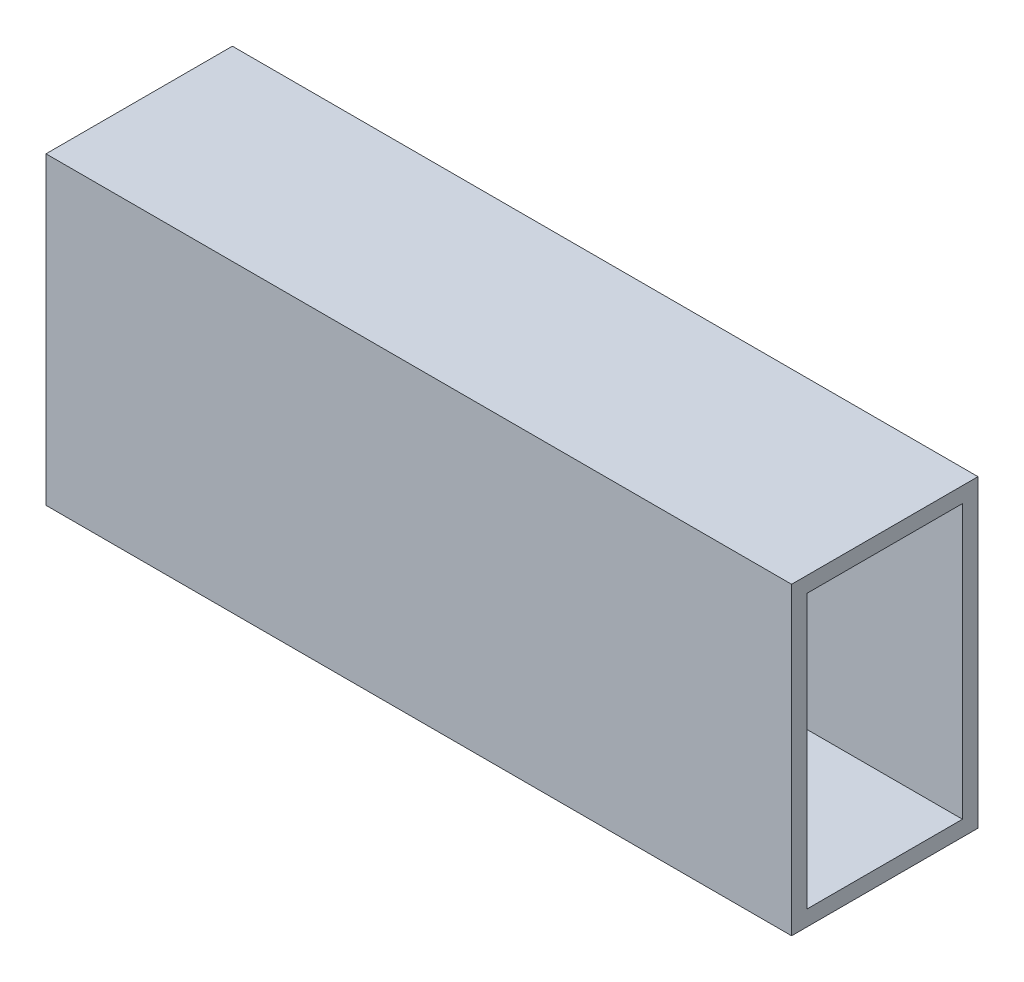
ISO-10303-21;
HEADER;
FILE_DESCRIPTION(('STEP AP214'),'2;1');
FILE_NAME('part.step','',(''),(''),'','','');
FILE_SCHEMA(('AUTOMOTIVE_DESIGN { 1 0 10303 214 1 1 1 1 }'));
ENDSEC;
DATA;
#1=APPLICATION_CONTEXT('core data for automotive mechanical design processes');
#2=APPLICATION_PROTOCOL_DEFINITION('international standard','automotive_design',2000,#1);
#3=PRODUCT_CONTEXT('',#1,'mechanical');
#4=PRODUCT('Part','Part','',(#3));
#5=PRODUCT_RELATED_PRODUCT_CATEGORY('part','',(#4));
#6=PRODUCT_DEFINITION_FORMATION('','',#4);
#7=PRODUCT_DEFINITION_CONTEXT('part definition',#1,'design');
#8=PRODUCT_DEFINITION('design','',#6,#7);
#9=PRODUCT_DEFINITION_SHAPE('','',#8);
#10=(LENGTH_UNIT() NAMED_UNIT(*) SI_UNIT(.MILLI.,.METRE.));
#11=(NAMED_UNIT(*) PLANE_ANGLE_UNIT() SI_UNIT($,.RADIAN.));
#12=(NAMED_UNIT(*) SI_UNIT($,.STERADIAN.) SOLID_ANGLE_UNIT());
#13=UNCERTAINTY_MEASURE_WITH_UNIT(LENGTH_MEASURE(1.E-05),#10,'distance_accuracy_value','');
#14=(GEOMETRIC_REPRESENTATION_CONTEXT(3) GLOBAL_UNCERTAINTY_ASSIGNED_CONTEXT((#13)) GLOBAL_UNIT_ASSIGNED_CONTEXT((#10,
#11,#12)) REPRESENTATION_CONTEXT('',''));
#15=CARTESIAN_POINT('',(0.,0.,0.));
#16=DIRECTION('',(0.,0.,1.));
#17=DIRECTION('',(1.,0.,0.));
#18=AXIS2_PLACEMENT_3D('',#15,#16,#17);
#19=CARTESIAN_POINT('',(0.,5.,0.));
#20=DIRECTION('',(0.,1.,0.));
#21=DIRECTION('',(0.,0.,1.));
#22=AXIS2_PLACEMENT_3D('',#19,#20,#21);
#23=PLANE('',#22);
#24=DIRECTION('',(0.,0.,1.));
#25=VECTOR('',#24,1.);
#26=CARTESIAN_POINT('',(-115.,5.,0.));
#27=LINE('',#26,#25);
#28=CARTESIAN_POINT('',(-115.,5.,-25.));
#29=VERTEX_POINT('',#28);
#30=CARTESIAN_POINT('',(-115.,5.,25.));
#31=VERTEX_POINT('',#30);
#32=EDGE_CURVE('E163',#29,#31,#27,.T.);
#33=ORIENTED_EDGE('',*,*,#32,.T.);
#34=DIRECTION('',(1.,0.,0.));
#35=VECTOR('',#34,1.);
#36=CARTESIAN_POINT('',(0.,5.,25.));
#37=LINE('',#36,#35);
#38=CARTESIAN_POINT('',(120.,5.,25.));
#39=VERTEX_POINT('',#38);
#40=EDGE_CURVE('E80',#31,#39,#37,.T.);
#41=ORIENTED_EDGE('',*,*,#40,.T.);
#42=DIRECTION('',(0.,0.,-1.));
#43=VECTOR('',#42,1.);
#44=CARTESIAN_POINT('',(120.,5.,-30.));
#45=LINE('',#44,#43);
#46=CARTESIAN_POINT('',(120.,5.,-25.));
#47=VERTEX_POINT('',#46);
#48=EDGE_CURVE('E181',#39,#47,#45,.T.);
#49=ORIENTED_EDGE('',*,*,#48,.T.);
#50=DIRECTION('',(1.,0.,0.));
#51=VECTOR('',#50,1.);
#52=CARTESIAN_POINT('',(-115.,5.,-25.));
#53=LINE('',#52,#51);
#54=EDGE_CURVE('E157',#29,#47,#53,.T.);
#55=ORIENTED_EDGE('',*,*,#54,.F.);
#56=EDGE_LOOP('',(#33,#41,#49,#55));
#57=FACE_BOUND('',#56,.T.);
#58=ADVANCED_FACE('F65',(#57),#23,.T.);
#59=CARTESIAN_POINT('',(120.,5.,-30.));
#60=DIRECTION('',(-1.,0.,0.));
#61=DIRECTION('',(0.,0.,1.));
#62=AXIS2_PLACEMENT_3D('',#59,#60,#61);
#63=PLANE('',#62);
#64=DIRECTION('',(0.,0.,-1.));
#65=VECTOR('',#64,1.);
#66=CARTESIAN_POINT('',(120.,93.,-30.));
#67=LINE('',#66,#65);
#68=CARTESIAN_POINT('',(120.,93.,25.));
#69=VERTEX_POINT('',#68);
#70=CARTESIAN_POINT('',(120.,93.,-25.));
#71=VERTEX_POINT('',#70);
#72=EDGE_CURVE('E151',#69,#71,#67,.T.);
#73=ORIENTED_EDGE('',*,*,#72,.T.);
#74=DIRECTION('',(0.,-1.,0.));
#75=VECTOR('',#74,1.);
#76=CARTESIAN_POINT('',(120.,93.,-25.));
#77=LINE('',#76,#75);
#78=EDGE_CURVE('E167',#71,#47,#77,.T.);
#79=ORIENTED_EDGE('',*,*,#78,.T.);
#80=ORIENTED_EDGE('',*,*,#48,.F.);
#81=DIRECTION('',(0.,-1.,0.));
#82=VECTOR('',#81,1.);
#83=CARTESIAN_POINT('',(120.,93.,25.));
#84=LINE('',#83,#82);
#85=EDGE_CURVE('E165',#69,#39,#84,.T.);
#86=ORIENTED_EDGE('',*,*,#85,.F.);
#87=EDGE_LOOP('',(#73,#79,#80,#86));
#88=FACE_BOUND('',#87,.T.);
#89=DIRECTION('',(0.,0.,-1.));
#90=VECTOR('',#89,1.);
#91=CARTESIAN_POINT('',(120.,0.,-30.));
#92=LINE('',#91,#90);
#93=CARTESIAN_POINT('',(120.,0.,30.));
#94=VERTEX_POINT('',#93);
#95=CARTESIAN_POINT('',(120.,0.,-30.));
#96=VERTEX_POINT('',#95);
#97=EDGE_CURVE('E136',#94,#96,#92,.T.);
#98=ORIENTED_EDGE('',*,*,#97,.T.);
#99=DIRECTION('',(0.,-1.,0.));
#100=VECTOR('',#99,1.);
#101=CARTESIAN_POINT('',(120.,5.,-30.));
#102=LINE('',#101,#100);
#103=CARTESIAN_POINT('',(120.,98.,-30.));
#104=VERTEX_POINT('',#103);
#105=EDGE_CURVE('E12',#104,#96,#102,.T.);
#106=ORIENTED_EDGE('',*,*,#105,.F.);
#107=DIRECTION('',(0.,0.,-1.));
#108=VECTOR('',#107,1.);
#109=CARTESIAN_POINT('',(120.,98.,-30.));
#110=LINE('',#109,#108);
#111=CARTESIAN_POINT('',(120.,98.,30.));
#112=VERTEX_POINT('',#111);
#113=EDGE_CURVE('E134',#112,#104,#110,.T.);
#114=ORIENTED_EDGE('',*,*,#113,.F.);
#115=DIRECTION('',(0.,-1.,0.));
#116=VECTOR('',#115,1.);
#117=CARTESIAN_POINT('',(120.,5.,30.));
#118=LINE('',#117,#116);
#119=EDGE_CURVE('E184',#112,#94,#118,.T.);
#120=ORIENTED_EDGE('',*,*,#119,.T.);
#121=EDGE_LOOP('',(#98,#106,#114,#120));
#122=FACE_BOUND('',#121,.T.);
#123=ADVANCED_FACE('F67',(#88,#122),#63,.F.);
#124=CARTESIAN_POINT('',(-120.,5.,-30.));
#125=DIRECTION('',(0.,0.,1.));
#126=DIRECTION('',(1.,0.,0.));
#127=AXIS2_PLACEMENT_3D('',#124,#125,#126);
#128=PLANE('',#127);
#129=DIRECTION('',(-1.,0.,0.));
#130=VECTOR('',#129,1.);
#131=CARTESIAN_POINT('',(-120.,0.,-30.));
#132=LINE('',#131,#130);
#133=CARTESIAN_POINT('',(-120.,0.,-30.));
#134=VERTEX_POINT('',#133);
#135=EDGE_CURVE('E186',#96,#134,#132,.T.);
#136=ORIENTED_EDGE('',*,*,#135,.T.);
#137=DIRECTION('',(0.,-1.,0.));
#138=VECTOR('',#137,1.);
#139=CARTESIAN_POINT('',(-120.,5.,-30.));
#140=LINE('',#139,#138);
#141=CARTESIAN_POINT('',(-120.,98.,-30.));
#142=VERTEX_POINT('',#141);
#143=EDGE_CURVE('E73',#142,#134,#140,.T.);
#144=ORIENTED_EDGE('',*,*,#143,.F.);
#145=DIRECTION('',(-1.,0.,0.));
#146=VECTOR('',#145,1.);
#147=CARTESIAN_POINT('',(-120.,98.,-30.));
#148=LINE('',#147,#146);
#149=EDGE_CURVE('E139',#104,#142,#148,.T.);
#150=ORIENTED_EDGE('',*,*,#149,.F.);
#151=ORIENTED_EDGE('',*,*,#105,.T.);
#152=EDGE_LOOP('',(#136,#144,#150,#151));
#153=FACE_BOUND('',#152,.T.);
#154=ADVANCED_FACE('F140',(#153),#128,.F.);
#155=CARTESIAN_POINT('',(-120.,5.,-30.));
#156=DIRECTION('',(1.,0.,0.));
#157=DIRECTION('',(0.,0.,-1.));
#158=AXIS2_PLACEMENT_3D('',#155,#156,#157);
#159=PLANE('',#158);
#160=DIRECTION('',(0.,0.,1.));
#161=VECTOR('',#160,1.);
#162=CARTESIAN_POINT('',(-120.,0.,-30.));
#163=LINE('',#162,#161);
#164=CARTESIAN_POINT('',(-120.,0.,30.));
#165=VERTEX_POINT('',#164);
#166=EDGE_CURVE('E188',#134,#165,#163,.T.);
#167=ORIENTED_EDGE('',*,*,#166,.T.);
#168=DIRECTION('',(0.,-1.,0.));
#169=VECTOR('',#168,1.);
#170=CARTESIAN_POINT('',(-120.,5.,30.));
#171=LINE('',#170,#169);
#172=CARTESIAN_POINT('',(-120.,98.,30.));
#173=VERTEX_POINT('',#172);
#174=EDGE_CURVE('E192',#173,#165,#171,.T.);
#175=ORIENTED_EDGE('',*,*,#174,.F.);
#176=DIRECTION('',(0.,0.,1.));
#177=VECTOR('',#176,1.);
#178=CARTESIAN_POINT('',(-120.,98.,-30.));
#179=LINE('',#178,#177);
#180=EDGE_CURVE('E145',#142,#173,#179,.T.);
#181=ORIENTED_EDGE('',*,*,#180,.F.);
#182=ORIENTED_EDGE('',*,*,#143,.T.);
#183=EDGE_LOOP('',(#167,#175,#181,#182));
#184=FACE_BOUND('',#183,.T.);
#185=ADVANCED_FACE('F195',(#184),#159,.F.);
#186=CARTESIAN_POINT('',(-120.,5.,30.));
#187=DIRECTION('',(0.,0.,-1.));
#188=DIRECTION('',(-1.,0.,0.));
#189=AXIS2_PLACEMENT_3D('',#186,#187,#188);
#190=PLANE('',#189);
#191=DIRECTION('',(1.,0.,0.));
#192=VECTOR('',#191,1.);
#193=CARTESIAN_POINT('',(-120.,0.,30.));
#194=LINE('',#193,#192);
#195=EDGE_CURVE('E88',#165,#94,#194,.T.);
#196=ORIENTED_EDGE('',*,*,#195,.T.);
#197=ORIENTED_EDGE('',*,*,#119,.F.);
#198=DIRECTION('',(1.,0.,0.));
#199=VECTOR('',#198,1.);
#200=CARTESIAN_POINT('',(-120.,98.,30.));
#201=LINE('',#200,#199);
#202=EDGE_CURVE('E150',#173,#112,#201,.T.);
#203=ORIENTED_EDGE('',*,*,#202,.F.);
#204=ORIENTED_EDGE('',*,*,#174,.T.);
#205=EDGE_LOOP('',(#196,#197,#203,#204));
#206=FACE_BOUND('',#205,.T.);
#207=ADVANCED_FACE('F200',(#206),#190,.F.);
#208=CARTESIAN_POINT('',(0.,0.,0.));
#209=DIRECTION('',(0.,1.,0.));
#210=DIRECTION('',(0.,0.,1.));
#211=AXIS2_PLACEMENT_3D('',#208,#209,#210);
#212=PLANE('',#211);
#213=ORIENTED_EDGE('',*,*,#97,.F.);
#214=ORIENTED_EDGE('',*,*,#195,.F.);
#215=ORIENTED_EDGE('',*,*,#166,.F.);
#216=ORIENTED_EDGE('',*,*,#135,.F.);
#217=EDGE_LOOP('',(#213,#214,#215,#216));
#218=FACE_BOUND('',#217,.T.);
#219=ADVANCED_FACE('F197',(#218),#212,.F.);
#220=CARTESIAN_POINT('',(-115.,93.,0.));
#221=DIRECTION('',(1.,0.,0.));
#222=DIRECTION('',(0.,0.,-1.));
#223=AXIS2_PLACEMENT_3D('',#220,#221,#222);
#224=PLANE('',#223);
#225=ORIENTED_EDGE('',*,*,#32,.F.);
#226=DIRECTION('',(0.,1.,0.));
#227=VECTOR('',#226,1.);
#228=CARTESIAN_POINT('',(-115.,93.,-25.));
#229=LINE('',#228,#227);
#230=CARTESIAN_POINT('',(-115.,93.,-25.));
#231=VERTEX_POINT('',#230);
#232=EDGE_CURVE('E173',#29,#231,#229,.T.);
#233=ORIENTED_EDGE('',*,*,#232,.T.);
#234=DIRECTION('',(0.,0.,1.));
#235=VECTOR('',#234,1.);
#236=CARTESIAN_POINT('',(-115.,93.,0.));
#237=LINE('',#236,#235);
#238=CARTESIAN_POINT('',(-115.,93.,25.));
#239=VERTEX_POINT('',#238);
#240=EDGE_CURVE('E162',#231,#239,#237,.T.);
#241=ORIENTED_EDGE('',*,*,#240,.T.);
#242=DIRECTION('',(0.,-1.,0.));
#243=VECTOR('',#242,1.);
#244=CARTESIAN_POINT('',(-115.,93.,25.));
#245=LINE('',#244,#243);
#246=EDGE_CURVE('E171',#239,#31,#245,.T.);
#247=ORIENTED_EDGE('',*,*,#246,.T.);
#248=EDGE_LOOP('',(#225,#233,#241,#247));
#249=FACE_BOUND('',#248,.T.);
#250=ADVANCED_FACE('F199',(#249),#224,.T.);
#251=CARTESIAN_POINT('',(0.,93.,25.));
#252=DIRECTION('',(0.,0.,-1.));
#253=DIRECTION('',(-1.,0.,0.));
#254=AXIS2_PLACEMENT_3D('',#251,#252,#253);
#255=PLANE('',#254);
#256=ORIENTED_EDGE('',*,*,#40,.F.);
#257=ORIENTED_EDGE('',*,*,#246,.F.);
#258=DIRECTION('',(1.,0.,0.));
#259=VECTOR('',#258,1.);
#260=CARTESIAN_POINT('',(0.,93.,25.));
#261=LINE('',#260,#259);
#262=EDGE_CURVE('E159',#239,#69,#261,.T.);
#263=ORIENTED_EDGE('',*,*,#262,.T.);
#264=ORIENTED_EDGE('',*,*,#85,.T.);
#265=EDGE_LOOP('',(#256,#257,#263,#264));
#266=FACE_BOUND('',#265,.T.);
#267=ADVANCED_FACE('F206',(#266),#255,.T.);
#268=CARTESIAN_POINT('',(-115.,93.,-25.));
#269=DIRECTION('',(0.,0.,-1.));
#270=DIRECTION('',(-1.,0.,0.));
#271=AXIS2_PLACEMENT_3D('',#268,#269,#270);
#272=PLANE('',#271);
#273=ORIENTED_EDGE('',*,*,#54,.T.);
#274=ORIENTED_EDGE('',*,*,#78,.F.);
#275=DIRECTION('',(1.,0.,0.));
#276=VECTOR('',#275,1.);
#277=CARTESIAN_POINT('',(-115.,93.,-25.));
#278=LINE('',#277,#276);
#279=EDGE_CURVE('E175',#231,#71,#278,.T.);
#280=ORIENTED_EDGE('',*,*,#279,.F.);
#281=ORIENTED_EDGE('',*,*,#232,.F.);
#282=EDGE_LOOP('',(#273,#274,#280,#281));
#283=FACE_BOUND('',#282,.T.);
#284=ADVANCED_FACE('F218',(#283),#272,.F.);
#285=CARTESIAN_POINT('',(0.,98.,0.));
#286=DIRECTION('',(0.,1.,0.));
#287=DIRECTION('',(0.,0.,1.));
#288=AXIS2_PLACEMENT_3D('',#285,#286,#287);
#289=PLANE('',#288);
#290=ORIENTED_EDGE('',*,*,#113,.T.);
#291=ORIENTED_EDGE('',*,*,#149,.T.);
#292=ORIENTED_EDGE('',*,*,#180,.T.);
#293=ORIENTED_EDGE('',*,*,#202,.T.);
#294=EDGE_LOOP('',(#290,#291,#292,#293));
#295=FACE_BOUND('',#294,.T.);
#296=ADVANCED_FACE('F148',(#295),#289,.T.);
#297=CARTESIAN_POINT('',(0.,93.,0.));
#298=DIRECTION('',(0.,1.,0.));
#299=DIRECTION('',(0.,0.,1.));
#300=AXIS2_PLACEMENT_3D('',#297,#298,#299);
#301=PLANE('',#300);
#302=ORIENTED_EDGE('',*,*,#262,.F.);
#303=ORIENTED_EDGE('',*,*,#240,.F.);
#304=ORIENTED_EDGE('',*,*,#279,.T.);
#305=ORIENTED_EDGE('',*,*,#72,.F.);
#306=EDGE_LOOP('',(#302,#303,#304,#305));
#307=FACE_BOUND('',#306,.T.);
#308=ADVANCED_FACE('F224',(#307),#301,.F.);
#309=CLOSED_SHELL('',(#58,#123,#154,#185,#207,#219,#250,#267,#284,#296,#308));
#310=MANIFOLD_SOLID_BREP('B2',#309);
#311=ADVANCED_BREP_SHAPE_REPRESENTATION('',(#18,#310),#14);
#312=SHAPE_DEFINITION_REPRESENTATION(#9,#311);
ENDSEC;
END-ISO-10303-21;
